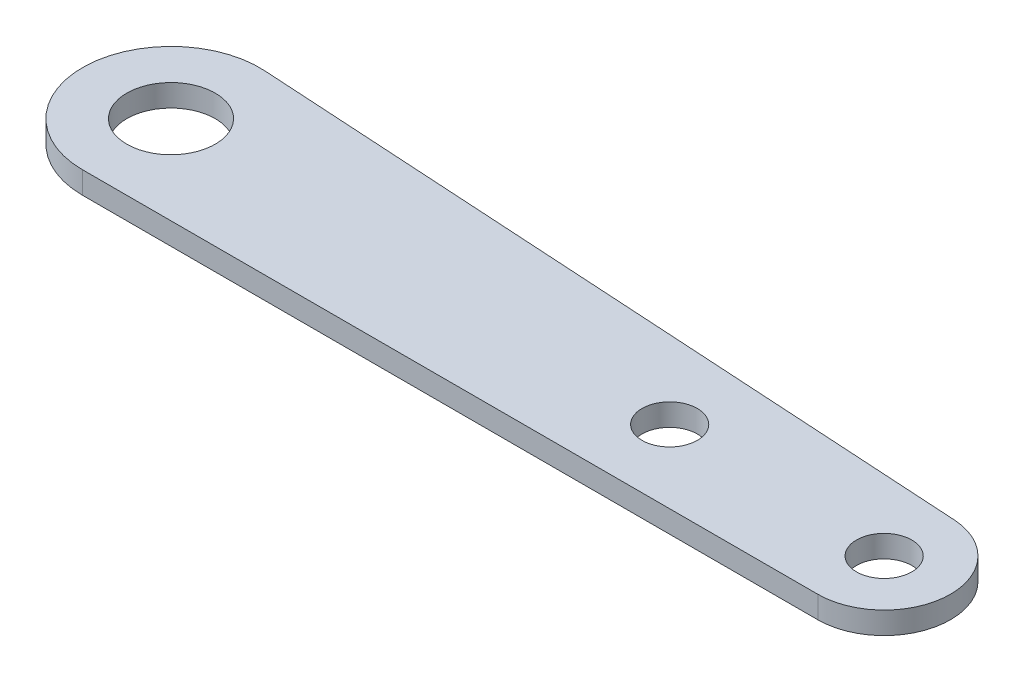
ISO-10303-21;
HEADER;
FILE_DESCRIPTION(('STEP AP214'),'2;1');
FILE_NAME('part.step','',(''),(''),'','','');
FILE_SCHEMA(('AUTOMOTIVE_DESIGN { 1 0 10303 214 1 1 1 1 }'));
ENDSEC;
DATA;
#1=APPLICATION_CONTEXT('core data for automotive mechanical design processes');
#2=APPLICATION_PROTOCOL_DEFINITION('international standard','automotive_design',2000,#1);
#3=PRODUCT_CONTEXT('',#1,'mechanical');
#4=PRODUCT('Part','Part','',(#3));
#5=PRODUCT_RELATED_PRODUCT_CATEGORY('part','',(#4));
#6=PRODUCT_DEFINITION_FORMATION('','',#4);
#7=PRODUCT_DEFINITION_CONTEXT('part definition',#1,'design');
#8=PRODUCT_DEFINITION('design','',#6,#7);
#9=PRODUCT_DEFINITION_SHAPE('','',#8);
#10=(LENGTH_UNIT() NAMED_UNIT(*) SI_UNIT(.MILLI.,.METRE.));
#11=(NAMED_UNIT(*) PLANE_ANGLE_UNIT() SI_UNIT($,.RADIAN.));
#12=(NAMED_UNIT(*) SI_UNIT($,.STERADIAN.) SOLID_ANGLE_UNIT());
#13=UNCERTAINTY_MEASURE_WITH_UNIT(LENGTH_MEASURE(1.E-05),#10,'distance_accuracy_value','');
#14=(GEOMETRIC_REPRESENTATION_CONTEXT(3) GLOBAL_UNCERTAINTY_ASSIGNED_CONTEXT((#13)) GLOBAL_UNIT_ASSIGNED_CONTEXT((#10,
#11,#12)) REPRESENTATION_CONTEXT('',''));
#15=CARTESIAN_POINT('',(0.,0.,0.));
#16=DIRECTION('',(0.,0.,1.));
#17=DIRECTION('',(1.,0.,0.));
#18=AXIS2_PLACEMENT_3D('',#15,#16,#17);
#19=CARTESIAN_POINT('',(-32.869694650518,2.,-2.03848283541871));
#20=DIRECTION('',(0.,-1.,0.));
#21=DIRECTION('',(0.,0.,-1.));
#22=AXIS2_PLACEMENT_3D('',#19,#20,#21);
#23=CYLINDRICAL_SURFACE('',#22,8.);
#24=CARTESIAN_POINT('',(-32.869694650518,0.,-2.03848283541871));
#25=DIRECTION('',(0.,1.,0.));
#26=DIRECTION('',(0.,0.,1.));
#27=AXIS2_PLACEMENT_3D('',#24,#25,#26);
#28=CIRCLE('',#27,8.);
#29=CARTESIAN_POINT('',(-32.3887093203674,0.,-10.0240105645159));
#30=VERTEX_POINT('',#29);
#31=CARTESIAN_POINT('',(-32.869694650518,0.,5.96151716458128));
#32=VERTEX_POINT('',#31);
#33=EDGE_CURVE('E117',#30,#32,#28,.T.);
#34=ORIENTED_EDGE('',*,*,#33,.T.);
#35=DIRECTION('',(0.,-1.,0.));
#36=VECTOR('',#35,1.);
#37=CARTESIAN_POINT('',(-32.869694650518,2.,5.96151716458128));
#38=LINE('',#37,#36);
#39=CARTESIAN_POINT('',(-32.869694650518,2.,5.96151716458128));
#40=VERTEX_POINT('',#39);
#41=EDGE_CURVE('E11',#40,#32,#38,.T.);
#42=ORIENTED_EDGE('',*,*,#41,.F.);
#43=CARTESIAN_POINT('',(-32.869694650518,2.,-2.03848283541871));
#44=DIRECTION('',(0.,1.,0.));
#45=DIRECTION('',(0.,0.,1.));
#46=AXIS2_PLACEMENT_3D('',#43,#44,#45);
#47=CIRCLE('',#46,8.);
#48=CARTESIAN_POINT('',(-32.3887093203674,2.,-10.0240105645159));
#49=VERTEX_POINT('',#48);
#50=EDGE_CURVE('E101',#49,#40,#47,.T.);
#51=ORIENTED_EDGE('',*,*,#50,.F.);
#52=DIRECTION('',(0.,-1.,0.));
#53=VECTOR('',#52,1.);
#54=CARTESIAN_POINT('',(-32.3887093203674,2.,-10.0240105645159));
#55=LINE('',#54,#53);
#56=EDGE_CURVE('E113',#49,#30,#55,.T.);
#57=ORIENTED_EDGE('',*,*,#56,.T.);
#58=EDGE_LOOP('',(#34,#42,#51,#57));
#59=FACE_BOUND('',#58,.T.);
#60=ADVANCED_FACE('F49',(#59),#23,.T.);
#61=CARTESIAN_POINT('',(-32.869694650518,2.,5.96151716458128));
#62=DIRECTION('',(0.,0.,-1.));
#63=DIRECTION('',(-1.,0.,0.));
#64=AXIS2_PLACEMENT_3D('',#61,#62,#63);
#65=PLANE('',#64);
#66=DIRECTION('',(1.,0.,0.));
#67=VECTOR('',#66,1.);
#68=CARTESIAN_POINT('',(-32.869694650518,0.,5.96151716458128));
#69=LINE('',#68,#67);
#70=CARTESIAN_POINT('',(33.6002233575554,0.,5.96151716458128));
#71=VERTEX_POINT('',#70);
#72=EDGE_CURVE('E106',#32,#71,#69,.T.);
#73=ORIENTED_EDGE('',*,*,#72,.T.);
#74=DIRECTION('',(0.,-1.,0.));
#75=VECTOR('',#74,1.);
#76=CARTESIAN_POINT('',(33.6002233575554,2.,5.96151716458128));
#77=LINE('',#76,#75);
#78=CARTESIAN_POINT('',(33.6002233575554,2.,5.96151716458128));
#79=VERTEX_POINT('',#78);
#80=EDGE_CURVE('E58',#79,#71,#77,.T.);
#81=ORIENTED_EDGE('',*,*,#80,.F.);
#82=DIRECTION('',(1.,0.,0.));
#83=VECTOR('',#82,1.);
#84=CARTESIAN_POINT('',(-32.869694650518,2.,5.96151716458128));
#85=LINE('',#84,#83);
#86=EDGE_CURVE('E96',#40,#79,#85,.T.);
#87=ORIENTED_EDGE('',*,*,#86,.F.);
#88=ORIENTED_EDGE('',*,*,#41,.T.);
#89=EDGE_LOOP('',(#73,#81,#87,#88));
#90=FACE_BOUND('',#89,.T.);
#91=ADVANCED_FACE('F105',(#90),#65,.F.);
#92=CARTESIAN_POINT('',(33.6002233575554,2.,-0.0384828354187176));
#93=DIRECTION('',(0.,-1.,0.));
#94=DIRECTION('',(0.,0.,-1.));
#95=AXIS2_PLACEMENT_3D('',#92,#93,#94);
#96=CYLINDRICAL_SURFACE('',#95,6.);
#97=CARTESIAN_POINT('',(33.6002233575554,0.,-0.0384828354187176));
#98=DIRECTION('',(0.,1.,0.));
#99=DIRECTION('',(0.,0.,1.));
#100=AXIS2_PLACEMENT_3D('',#97,#98,#99);
#101=CIRCLE('',#100,6.);
#102=CARTESIAN_POINT('',(33.9609623551683,0.,-6.0276286322416));
#103=VERTEX_POINT('',#102);
#104=EDGE_CURVE('E83',#71,#103,#101,.T.);
#105=ORIENTED_EDGE('',*,*,#104,.T.);
#106=DIRECTION('',(0.,-1.,0.));
#107=VECTOR('',#106,1.);
#108=CARTESIAN_POINT('',(33.9609623551683,2.,-6.0276286322416));
#109=LINE('',#108,#107);
#110=CARTESIAN_POINT('',(33.9609623551683,2.,-6.0276286322416));
#111=VERTEX_POINT('',#110);
#112=EDGE_CURVE('E108',#111,#103,#109,.T.);
#113=ORIENTED_EDGE('',*,*,#112,.F.);
#114=CARTESIAN_POINT('',(33.6002233575554,2.,-0.0384828354187176));
#115=DIRECTION('',(0.,1.,0.));
#116=DIRECTION('',(0.,0.,1.));
#117=AXIS2_PLACEMENT_3D('',#114,#115,#116);
#118=CIRCLE('',#117,6.);
#119=EDGE_CURVE('E99',#79,#111,#118,.T.);
#120=ORIENTED_EDGE('',*,*,#119,.F.);
#121=ORIENTED_EDGE('',*,*,#80,.T.);
#122=EDGE_LOOP('',(#105,#113,#120,#121));
#123=FACE_BOUND('',#122,.T.);
#124=ADVANCED_FACE('F109',(#123),#96,.T.);
#125=CARTESIAN_POINT('',(-32.3887093203674,2.,-10.0240105645159));
#126=DIRECTION('',(-0.0601231662688209,0.,0.998190966137147));
#127=DIRECTION('',(0.998190966137147,0.,0.0601231662688209));
#128=AXIS2_PLACEMENT_3D('',#125,#126,#127);
#129=PLANE('',#128);
#130=DIRECTION('',(-0.998190966137147,0.,-0.0601231662688209));
#131=VECTOR('',#130,1.);
#132=CARTESIAN_POINT('',(-32.3887093203674,0.,-10.0240105645159));
#133=LINE('',#132,#131);
#134=EDGE_CURVE('E89',#103,#30,#133,.T.);
#135=ORIENTED_EDGE('',*,*,#134,.T.);
#136=ORIENTED_EDGE('',*,*,#56,.F.);
#137=DIRECTION('',(-0.998190966137147,0.,-0.0601231662688209));
#138=VECTOR('',#137,1.);
#139=CARTESIAN_POINT('',(-32.3887093203674,2.,-10.0240105645159));
#140=LINE('',#139,#138);
#141=EDGE_CURVE('E66',#111,#49,#140,.T.);
#142=ORIENTED_EDGE('',*,*,#141,.F.);
#143=ORIENTED_EDGE('',*,*,#112,.T.);
#144=EDGE_LOOP('',(#135,#136,#142,#143));
#145=FACE_BOUND('',#144,.T.);
#146=ADVANCED_FACE('F131',(#145),#129,.F.);
#147=CARTESIAN_POINT('',(-32.869694650518,2.,-2.03848283541871));
#148=DIRECTION('',(0.,1.,0.));
#149=DIRECTION('',(0.,0.,1.));
#150=AXIS2_PLACEMENT_3D('',#147,#148,#149);
#151=PLANE('',#150);
#152=CARTESIAN_POINT('',(-32.869694650518,2.,-2.03848283541871));
#153=DIRECTION('',(0.,1.,0.));
#154=DIRECTION('',(0.,0.,1.));
#155=AXIS2_PLACEMENT_3D('',#152,#153,#154);
#156=CIRCLE('',#155,4.);
#157=CARTESIAN_POINT('',(-32.869694650518,2.,1.96151716458129));
#158=VERTEX_POINT('',#157);
#159=EDGE_CURVE('E154',#158,#158,#156,.T.);
#160=ORIENTED_EDGE('',*,*,#159,.F.);
#161=EDGE_LOOP('',(#160));
#162=FACE_BOUND('',#161,.T.);
#163=CARTESIAN_POINT('',(33.6002233575554,2.,-0.0384828354187176));
#164=DIRECTION('',(0.,1.,0.));
#165=DIRECTION('',(0.,0.,1.));
#166=AXIS2_PLACEMENT_3D('',#163,#164,#165);
#167=CIRCLE('',#166,2.5);
#168=CARTESIAN_POINT('',(33.6002233575554,2.,2.46151716458128));
#169=VERTEX_POINT('',#168);
#170=EDGE_CURVE('E150',#169,#169,#167,.T.);
#171=ORIENTED_EDGE('',*,*,#170,.F.);
#172=EDGE_LOOP('',(#171));
#173=FACE_BOUND('',#172,.T.);
#174=CARTESIAN_POINT('',(13.6092705731724,2.,-0.639986594817212));
#175=DIRECTION('',(0.,1.,0.));
#176=DIRECTION('',(0.,0.,1.));
#177=AXIS2_PLACEMENT_3D('',#174,#175,#176);
#178=CIRCLE('',#177,2.5);
#179=CARTESIAN_POINT('',(13.6092705731724,2.,1.86001340518279));
#180=VERTEX_POINT('',#179);
#181=EDGE_CURVE('E142',#180,#180,#178,.T.);
#182=ORIENTED_EDGE('',*,*,#181,.F.);
#183=EDGE_LOOP('',(#182));
#184=FACE_BOUND('',#183,.T.);
#185=ORIENTED_EDGE('',*,*,#50,.T.);
#186=ORIENTED_EDGE('',*,*,#86,.T.);
#187=ORIENTED_EDGE('',*,*,#119,.T.);
#188=ORIENTED_EDGE('',*,*,#141,.T.);
#189=EDGE_LOOP('',(#185,#186,#187,#188));
#190=FACE_BOUND('',#189,.T.);
#191=ADVANCED_FACE('F97',(#162,#173,#184,#190),#151,.T.);
#192=CARTESIAN_POINT('',(-32.869694650518,0.,-2.03848283541871));
#193=DIRECTION('',(0.,1.,0.));
#194=DIRECTION('',(0.,0.,1.));
#195=AXIS2_PLACEMENT_3D('',#192,#193,#194);
#196=PLANE('',#195);
#197=CARTESIAN_POINT('',(-32.869694650518,0.,-2.03848283541871));
#198=DIRECTION('',(0.,1.,0.));
#199=DIRECTION('',(0.,0.,1.));
#200=AXIS2_PLACEMENT_3D('',#197,#198,#199);
#201=CIRCLE('',#200,4.);
#202=CARTESIAN_POINT('',(-32.869694650518,0.,1.96151716458129));
#203=VERTEX_POINT('',#202);
#204=EDGE_CURVE('E121',#203,#203,#201,.T.);
#205=ORIENTED_EDGE('',*,*,#204,.T.);
#206=EDGE_LOOP('',(#205));
#207=FACE_BOUND('',#206,.T.);
#208=CARTESIAN_POINT('',(33.6002233575554,0.,-0.0384828354187176));
#209=DIRECTION('',(0.,1.,0.));
#210=DIRECTION('',(0.,0.,1.));
#211=AXIS2_PLACEMENT_3D('',#208,#209,#210);
#212=CIRCLE('',#211,2.5);
#213=CARTESIAN_POINT('',(33.6002233575554,0.,2.46151716458128));
#214=VERTEX_POINT('',#213);
#215=EDGE_CURVE('E146',#214,#214,#212,.T.);
#216=ORIENTED_EDGE('',*,*,#215,.T.);
#217=EDGE_LOOP('',(#216));
#218=FACE_BOUND('',#217,.T.);
#219=CARTESIAN_POINT('',(13.6092705731724,0.,-0.639986594817212));
#220=DIRECTION('',(0.,1.,0.));
#221=DIRECTION('',(0.,0.,1.));
#222=AXIS2_PLACEMENT_3D('',#219,#220,#221);
#223=CIRCLE('',#222,2.5);
#224=CARTESIAN_POINT('',(13.6092705731724,0.,1.86001340518279));
#225=VERTEX_POINT('',#224);
#226=EDGE_CURVE('E138',#225,#225,#223,.T.);
#227=ORIENTED_EDGE('',*,*,#226,.T.);
#228=EDGE_LOOP('',(#227));
#229=FACE_BOUND('',#228,.T.);
#230=ORIENTED_EDGE('',*,*,#33,.F.);
#231=ORIENTED_EDGE('',*,*,#134,.F.);
#232=ORIENTED_EDGE('',*,*,#104,.F.);
#233=ORIENTED_EDGE('',*,*,#72,.F.);
#234=EDGE_LOOP('',(#230,#231,#232,#233));
#235=FACE_BOUND('',#234,.T.);
#236=ADVANCED_FACE('F134',(#207,#218,#229,#235),#196,.F.);
#237=CARTESIAN_POINT('',(13.6092705731724,0.,-0.639986594817212));
#238=DIRECTION('',(0.,1.,0.));
#239=DIRECTION('',(0.,0.,1.));
#240=AXIS2_PLACEMENT_3D('',#237,#238,#239);
#241=CYLINDRICAL_SURFACE('',#240,2.5);
#242=ORIENTED_EDGE('',*,*,#226,.F.);
#243=EDGE_LOOP('',(#242));
#244=FACE_BOUND('',#243,.T.);
#245=ORIENTED_EDGE('',*,*,#181,.T.);
#246=EDGE_LOOP('',(#245));
#247=FACE_BOUND('',#246,.T.);
#248=ADVANCED_FACE('F178',(#244,#247),#241,.F.);
#249=CARTESIAN_POINT('',(33.6002233575554,0.,-0.0384828354187176));
#250=DIRECTION('',(0.,1.,0.));
#251=DIRECTION('',(0.,0.,1.));
#252=AXIS2_PLACEMENT_3D('',#249,#250,#251);
#253=CYLINDRICAL_SURFACE('',#252,2.5);
#254=ORIENTED_EDGE('',*,*,#215,.F.);
#255=EDGE_LOOP('',(#254));
#256=FACE_BOUND('',#255,.T.);
#257=ORIENTED_EDGE('',*,*,#170,.T.);
#258=EDGE_LOOP('',(#257));
#259=FACE_BOUND('',#258,.T.);
#260=ADVANCED_FACE('F167',(#256,#259),#253,.F.);
#261=CARTESIAN_POINT('',(-32.869694650518,0.,-2.03848283541871));
#262=DIRECTION('',(0.,1.,0.));
#263=DIRECTION('',(0.,0.,1.));
#264=AXIS2_PLACEMENT_3D('',#261,#262,#263);
#265=CYLINDRICAL_SURFACE('',#264,4.);
#266=ORIENTED_EDGE('',*,*,#204,.F.);
#267=EDGE_LOOP('',(#266));
#268=FACE_BOUND('',#267,.T.);
#269=ORIENTED_EDGE('',*,*,#159,.T.);
#270=EDGE_LOOP('',(#269));
#271=FACE_BOUND('',#270,.T.);
#272=ADVANCED_FACE('F164',(#268,#271),#265,.F.);
#273=CLOSED_SHELL('',(#60,#91,#124,#146,#191,#236,#248,#260,#272));
#274=MANIFOLD_SOLID_BREP('B2',#273);
#275=ADVANCED_BREP_SHAPE_REPRESENTATION('',(#18,#274),#14);
#276=SHAPE_DEFINITION_REPRESENTATION(#9,#275);
ENDSEC;
END-ISO-10303-21;
